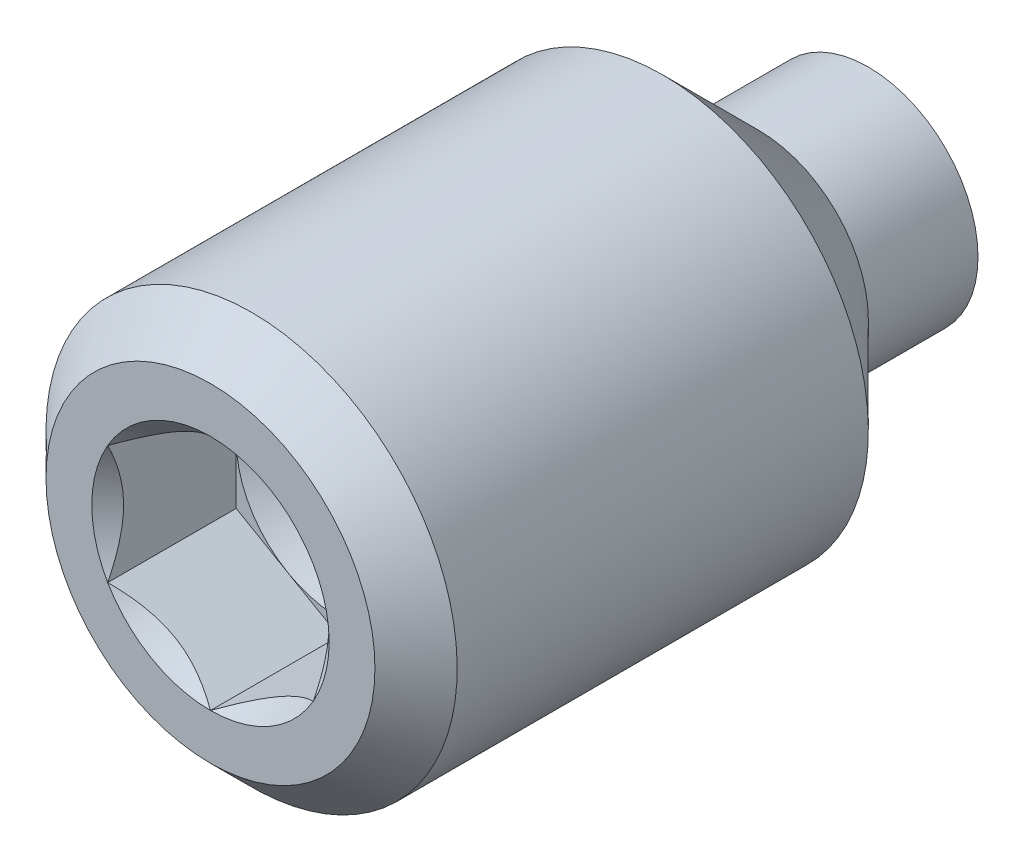
ISO-10303-21;
HEADER;
FILE_DESCRIPTION(('STEP AP214'),'2;1');
FILE_NAME('part.step','',(''),(''),'','','');
FILE_SCHEMA(('AUTOMOTIVE_DESIGN { 1 0 10303 214 1 1 1 1 }'));
ENDSEC;
DATA;
#1=APPLICATION_CONTEXT('core data for automotive mechanical design processes');
#2=APPLICATION_PROTOCOL_DEFINITION('international standard','automotive_design',2000,#1);
#3=PRODUCT_CONTEXT('',#1,'mechanical');
#4=PRODUCT('Part','Part','',(#3));
#5=PRODUCT_RELATED_PRODUCT_CATEGORY('part','',(#4));
#6=PRODUCT_DEFINITION_FORMATION('','',#4);
#7=PRODUCT_DEFINITION_CONTEXT('part definition',#1,'design');
#8=PRODUCT_DEFINITION('design','',#6,#7);
#9=PRODUCT_DEFINITION_SHAPE('','',#8);
#10=(LENGTH_UNIT() NAMED_UNIT(*) SI_UNIT(.MILLI.,.METRE.));
#11=(NAMED_UNIT(*) PLANE_ANGLE_UNIT() SI_UNIT($,.RADIAN.));
#12=(NAMED_UNIT(*) SI_UNIT($,.STERADIAN.) SOLID_ANGLE_UNIT());
#13=UNCERTAINTY_MEASURE_WITH_UNIT(LENGTH_MEASURE(1.E-05),#10,'distance_accuracy_value','');
#14=(GEOMETRIC_REPRESENTATION_CONTEXT(3) GLOBAL_UNCERTAINTY_ASSIGNED_CONTEXT((#13)) GLOBAL_UNIT_ASSIGNED_CONTEXT((#10,
#11,#12)) REPRESENTATION_CONTEXT('',''));
#15=CARTESIAN_POINT('',(0.,0.,0.));
#16=DIRECTION('',(0.,0.,1.));
#17=DIRECTION('',(1.,0.,0.));
#18=AXIS2_PLACEMENT_3D('',#15,#16,#17);
#19=CARTESIAN_POINT('',(0.75,-0.433012701892215,1.4625));
#20=DIRECTION('',(0.,0.,1.));
#21=DIRECTION('',(1.,0.,0.));
#22=AXIS2_PLACEMENT_3D('',#19,#20,#21);
#23=PLANE('',#22);
#24=CARTESIAN_POINT('',(0.,0.,1.4625));
#25=DIRECTION('',(0.,0.,1.));
#26=DIRECTION('',(1.,0.,0.));
#27=AXIS2_PLACEMENT_3D('',#24,#25,#26);
#28=CIRCLE('',#27,0.749999999999999);
#29=CARTESIAN_POINT('',(0.75,0.,1.4625));
#30=VERTEX_POINT('',#29);
#31=CARTESIAN_POINT('',(0.375,0.649519052838333,1.4625));
#32=VERTEX_POINT('',#31);
#33=EDGE_CURVE('E119',#30,#32,#28,.T.);
#34=ORIENTED_EDGE('',*,*,#33,.F.);
#35=DIRECTION('',(0.,1.,0.));
#36=VECTOR('',#35,1.);
#37=CARTESIAN_POINT('',(0.75,-0.433012701892215,1.4625));
#38=LINE('',#37,#36);
#39=CARTESIAN_POINT('',(0.75,0.433012701892224,1.4625));
#40=VERTEX_POINT('',#39);
#41=EDGE_CURVE('E148',#30,#40,#38,.T.);
#42=ORIENTED_EDGE('',*,*,#41,.T.);
#43=DIRECTION('',(-0.866025403784439,0.5,0.));
#44=VECTOR('',#43,1.);
#45=CARTESIAN_POINT('',(0.75,0.433012701892224,1.4625));
#46=LINE('',#45,#44);
#47=EDGE_CURVE('E142',#40,#32,#46,.T.);
#48=ORIENTED_EDGE('',*,*,#47,.T.);
#49=EDGE_LOOP('',(#34,#42,#48));
#50=FACE_BOUND('',#49,.T.);
#51=ADVANCED_FACE('F35',(#50),#23,.T.);
#52=CARTESIAN_POINT('',(-0.375,0.649519052838333,1.4625));
#53=VERTEX_POINT('',#52);
#54=EDGE_CURVE('E121',#32,#53,#28,.T.);
#55=ORIENTED_EDGE('',*,*,#54,.F.);
#56=CARTESIAN_POINT('',(0.,0.866025403784443,1.4625));
#57=VERTEX_POINT('',#56);
#58=EDGE_CURVE('E133',#32,#57,#46,.T.);
#59=ORIENTED_EDGE('',*,*,#58,.T.);
#60=DIRECTION('',(-0.866025403784439,-0.5,0.));
#61=VECTOR('',#60,1.);
#62=CARTESIAN_POINT('',(0.,0.866025403784443,1.4625));
#63=LINE('',#62,#61);
#64=EDGE_CURVE('E136',#57,#53,#63,.T.);
#65=ORIENTED_EDGE('',*,*,#64,.T.);
#66=EDGE_LOOP('',(#55,#59,#65));
#67=FACE_BOUND('',#66,.T.);
#68=ADVANCED_FACE('F132',(#67),#23,.T.);
#69=CARTESIAN_POINT('',(-0.75,0.,1.4625));
#70=VERTEX_POINT('',#69);
#71=EDGE_CURVE('E137',#53,#70,#28,.T.);
#72=ORIENTED_EDGE('',*,*,#71,.F.);
#73=CARTESIAN_POINT('',(-0.75,0.433012701892224,1.4625));
#74=VERTEX_POINT('',#73);
#75=EDGE_CURVE('E150',#53,#74,#63,.T.);
#76=ORIENTED_EDGE('',*,*,#75,.T.);
#77=DIRECTION('',(0.,-1.,0.));
#78=VECTOR('',#77,1.);
#79=CARTESIAN_POINT('',(-0.75,0.433012701892224,1.4625));
#80=LINE('',#79,#78);
#81=EDGE_CURVE('E156',#74,#70,#80,.T.);
#82=ORIENTED_EDGE('',*,*,#81,.T.);
#83=EDGE_LOOP('',(#72,#76,#82));
#84=FACE_BOUND('',#83,.T.);
#85=ADVANCED_FACE('F211',(#84),#23,.T.);
#86=CARTESIAN_POINT('',(-0.375,-0.649519052838325,1.4625));
#87=VERTEX_POINT('',#86);
#88=EDGE_CURVE('E496',#70,#87,#28,.T.);
#89=ORIENTED_EDGE('',*,*,#88,.F.);
#90=CARTESIAN_POINT('',(-0.75,-0.433012701892215,1.4625));
#91=VERTEX_POINT('',#90);
#92=EDGE_CURVE('E155',#70,#91,#80,.T.);
#93=ORIENTED_EDGE('',*,*,#92,.T.);
#94=DIRECTION('',(0.866025403784438,-0.5,0.));
#95=VECTOR('',#94,1.);
#96=CARTESIAN_POINT('',(-0.75,-0.433012701892215,1.4625));
#97=LINE('',#96,#95);
#98=EDGE_CURVE('E160',#91,#87,#97,.T.);
#99=ORIENTED_EDGE('',*,*,#98,.T.);
#100=EDGE_LOOP('',(#89,#93,#99));
#101=FACE_BOUND('',#100,.T.);
#102=ADVANCED_FACE('F202',(#101),#23,.T.);
#103=CARTESIAN_POINT('',(0.375,-0.649519052838325,1.4625));
#104=VERTEX_POINT('',#103);
#105=EDGE_CURVE('E56',#87,#104,#28,.T.);
#106=ORIENTED_EDGE('',*,*,#105,.F.);
#107=CARTESIAN_POINT('',(0.,-0.866025403784435,1.4625));
#108=VERTEX_POINT('',#107);
#109=EDGE_CURVE('E159',#87,#108,#97,.T.);
#110=ORIENTED_EDGE('',*,*,#109,.T.);
#111=DIRECTION('',(0.866025403784439,0.5,0.));
#112=VECTOR('',#111,1.);
#113=CARTESIAN_POINT('',(0.,-0.866025403784435,1.4625));
#114=LINE('',#113,#112);
#115=EDGE_CURVE('E233',#108,#104,#114,.T.);
#116=ORIENTED_EDGE('',*,*,#115,.T.);
#117=EDGE_LOOP('',(#106,#110,#116));
#118=FACE_BOUND('',#117,.T.);
#119=ADVANCED_FACE('F195',(#118),#23,.T.);
#120=CARTESIAN_POINT('',(0.,0.,2.4));
#121=DIRECTION('',(0.,0.,1.));
#122=DIRECTION('',(0.,-1.,0.));
#123=AXIS2_PLACEMENT_3D('',#120,#121,#122);
#124=PLANE('',#123);
#125=CARTESIAN_POINT('',(0.,0.,2.4));
#126=DIRECTION('',(0.,0.,1.));
#127=DIRECTION('',(1.,0.,0.));
#128=AXIS2_PLACEMENT_3D('',#125,#126,#127);
#129=CIRCLE('',#128,0.866025403784439);
#130=CARTESIAN_POINT('',(0.,-0.866025403784435,2.4));
#131=VERTEX_POINT('',#130);
#132=CARTESIAN_POINT('',(0.75,-0.433012701892215,2.4));
#133=VERTEX_POINT('',#132);
#134=EDGE_CURVE('E478',#131,#133,#129,.T.);
#135=ORIENTED_EDGE('',*,*,#134,.F.);
#136=CARTESIAN_POINT('',(-0.75,-0.433012701892215,2.4));
#137=VERTEX_POINT('',#136);
#138=EDGE_CURVE('E63',#137,#131,#129,.T.);
#139=ORIENTED_EDGE('',*,*,#138,.F.);
#140=CARTESIAN_POINT('',(-0.75,0.433012701892224,2.4));
#141=VERTEX_POINT('',#140);
#142=EDGE_CURVE('E484',#141,#137,#129,.T.);
#143=ORIENTED_EDGE('',*,*,#142,.F.);
#144=CARTESIAN_POINT('',(0.,0.866025403784443,2.4));
#145=VERTEX_POINT('',#144);
#146=EDGE_CURVE('E482',#145,#141,#129,.T.);
#147=ORIENTED_EDGE('',*,*,#146,.F.);
#148=CARTESIAN_POINT('',(0.75,0.433012701892224,2.4));
#149=VERTEX_POINT('',#148);
#150=EDGE_CURVE('E479',#149,#145,#129,.T.);
#151=ORIENTED_EDGE('',*,*,#150,.F.);
#152=EDGE_CURVE('E127',#133,#149,#129,.T.);
#153=ORIENTED_EDGE('',*,*,#152,.F.);
#154=EDGE_LOOP('',(#135,#139,#143,#147,#151,#153));
#155=FACE_BOUND('',#154,.T.);
#156=CARTESIAN_POINT('',(0.,0.,2.4));
#157=DIRECTION('',(0.,0.,-1.));
#158=DIRECTION('',(0.,1.,0.));
#159=AXIS2_PLACEMENT_3D('',#156,#157,#158);
#160=CIRCLE('',#159,1.2);
#161=CARTESIAN_POINT('',(0.,1.2,2.4));
#162=VERTEX_POINT('',#161);
#163=EDGE_CURVE('E49',#162,#162,#160,.T.);
#164=ORIENTED_EDGE('',*,*,#163,.F.);
#165=EDGE_LOOP('',(#164));
#166=FACE_BOUND('',#165,.T.);
#167=ADVANCED_FACE('F37',(#155,#166),#124,.T.);
#168=CARTESIAN_POINT('',(0.,0.,2.1));
#169=DIRECTION('',(0.,0.,-1.));
#170=DIRECTION('',(0.,1.,0.));
#171=AXIS2_PLACEMENT_3D('',#168,#169,#170);
#172=CONICAL_SURFACE('',#171,1.5,0.785398163397448);
#173=ORIENTED_EDGE('',*,*,#163,.T.);
#174=EDGE_LOOP('',(#173));
#175=FACE_BOUND('',#174,.T.);
#176=CARTESIAN_POINT('',(0.,0.,2.1));
#177=DIRECTION('',(0.,0.,-1.));
#178=DIRECTION('',(0.,1.,0.));
#179=AXIS2_PLACEMENT_3D('',#176,#177,#178);
#180=CIRCLE('',#179,1.5);
#181=CARTESIAN_POINT('',(0.,1.5,2.1));
#182=VERTEX_POINT('',#181);
#183=EDGE_CURVE('E186',#182,#182,#180,.T.);
#184=ORIENTED_EDGE('',*,*,#183,.F.);
#185=EDGE_LOOP('',(#184));
#186=FACE_BOUND('',#185,.T.);
#187=ADVANCED_FACE('F191',(#175,#186),#172,.T.);
#188=CARTESIAN_POINT('',(0.,0.,-2.4));
#189=DIRECTION('',(0.,0.,-1.));
#190=DIRECTION('',(0.,1.,0.));
#191=AXIS2_PLACEMENT_3D('',#188,#189,#190);
#192=CYLINDRICAL_SURFACE('',#191,1.5);
#193=ORIENTED_EDGE('',*,*,#183,.T.);
#194=EDGE_LOOP('',(#193));
#195=FACE_BOUND('',#194,.T.);
#196=CARTESIAN_POINT('',(0.,0.,-0.900000000000009));
#197=DIRECTION('',(0.,0.,-1.));
#198=DIRECTION('',(0.,1.,0.));
#199=AXIS2_PLACEMENT_3D('',#196,#197,#198);
#200=CIRCLE('',#199,1.5);
#201=CARTESIAN_POINT('',(0.,1.5,-0.900000000000008));
#202=VERTEX_POINT('',#201);
#203=EDGE_CURVE('E183',#202,#202,#200,.T.);
#204=ORIENTED_EDGE('',*,*,#203,.F.);
#205=EDGE_LOOP('',(#204));
#206=FACE_BOUND('',#205,.T.);
#207=ADVANCED_FACE('F201',(#195,#206),#192,.T.);
#208=CARTESIAN_POINT('',(0.,0.,-1.6));
#209=DIRECTION('',(0.,0.,1.));
#210=DIRECTION('',(0.,-1.,0.));
#211=AXIS2_PLACEMENT_3D('',#208,#209,#210);
#212=CONICAL_SURFACE('',#211,0.800000000000001,0.785398163397454);
#213=ORIENTED_EDGE('',*,*,#203,.T.);
#214=EDGE_LOOP('',(#213));
#215=FACE_BOUND('',#214,.T.);
#216=CARTESIAN_POINT('',(0.,0.,-1.6));
#217=DIRECTION('',(0.,0.,-1.));
#218=DIRECTION('',(0.,1.,0.));
#219=AXIS2_PLACEMENT_3D('',#216,#217,#218);
#220=CIRCLE('',#219,0.800000000000001);
#221=CARTESIAN_POINT('',(0.,0.8,-1.6));
#222=VERTEX_POINT('',#221);
#223=EDGE_CURVE('E180',#222,#222,#220,.T.);
#224=ORIENTED_EDGE('',*,*,#223,.F.);
#225=EDGE_LOOP('',(#224));
#226=FACE_BOUND('',#225,.T.);
#227=ADVANCED_FACE('F428',(#215,#226),#212,.T.);
#228=CARTESIAN_POINT('',(0.,0.,-2.4));
#229=DIRECTION('',(0.,0.,-1.));
#230=DIRECTION('',(0.,1.,0.));
#231=AXIS2_PLACEMENT_3D('',#228,#229,#230);
#232=CYLINDRICAL_SURFACE('',#231,0.800000000000001);
#233=ORIENTED_EDGE('',*,*,#223,.T.);
#234=EDGE_LOOP('',(#233));
#235=FACE_BOUND('',#234,.T.);
#236=CARTESIAN_POINT('',(0.,0.,-2.4));
#237=DIRECTION('',(0.,0.,-1.));
#238=DIRECTION('',(0.,1.,0.));
#239=AXIS2_PLACEMENT_3D('',#236,#237,#238);
#240=CIRCLE('',#239,0.800000000000001);
#241=CARTESIAN_POINT('',(0.,0.8,-2.4));
#242=VERTEX_POINT('',#241);
#243=EDGE_CURVE('E167',#242,#242,#240,.T.);
#244=ORIENTED_EDGE('',*,*,#243,.F.);
#245=EDGE_LOOP('',(#244));
#246=FACE_BOUND('',#245,.T.);
#247=ADVANCED_FACE('F420',(#235,#246),#232,.T.);
#248=CARTESIAN_POINT('',(0.,0.8,-2.4));
#249=DIRECTION('',(0.,0.,-1.));
#250=DIRECTION('',(0.,1.,0.));
#251=AXIS2_PLACEMENT_3D('',#248,#249,#250);
#252=PLANE('',#251);
#253=ORIENTED_EDGE('',*,*,#243,.T.);
#254=EDGE_LOOP('',(#253));
#255=FACE_BOUND('',#254,.T.);
#256=ADVANCED_FACE('F394',(#255),#252,.T.);
#257=CARTESIAN_POINT('',(0.,0.,2.4));
#258=DIRECTION('',(0.,0.,1.));
#259=DIRECTION('',(1.,0.,0.));
#260=AXIS2_PLACEMENT_3D('',#257,#258,#259);
#261=CONICAL_SURFACE('',#260,0.866025403784439,0.78539816339745);
#262=ORIENTED_EDGE('',*,*,#152,.T.);
#263=CARTESIAN_POINT('',(0.75,-0.863604064848459,2.6777892581354));
#264=CARTESIAN_POINT('',(0.75,-0.842575879734329,2.66191493200841));
#265=CARTESIAN_POINT('',(0.75,-0.821430496291557,2.646196265183));
#266=CARTESIAN_POINT('',(0.75,-0.778857857419016,2.61513452062663));
#267=CARTESIAN_POINT('',(0.75,-0.757430533042233,2.59979153749355));
#268=CARTESIAN_POINT('',(0.75,-0.692340710712932,2.55420358029367));
#269=CARTESIAN_POINT('',(0.75,-0.648190081053409,2.52464409174343));
#270=CARTESIAN_POINT('',(0.75,-0.555607181501746,2.4666155826928));
#271=CARTESIAN_POINT('',(0.75,-0.507074363017992,2.43830510936579));
#272=CARTESIAN_POINT('',(0.75,-0.407587529772333,2.38651811176889));
#273=CARTESIAN_POINT('',(0.75,-0.356642419548466,2.36302529153185));
#274=CARTESIAN_POINT('',(0.75,-0.280165468820766,2.33428689950068));
#275=CARTESIAN_POINT('',(0.75,-0.255770023930567,2.32603927481305));
#276=CARTESIAN_POINT('',(0.75,-0.206403277885127,2.31149717542019));
#277=CARTESIAN_POINT('',(0.75,-0.181431937185902,2.30520283526912));
#278=CARTESIAN_POINT('',(0.75,-0.10669987940492,2.2899931738806));
#279=CARTESIAN_POINT('',(0.75,-0.0561907171762129,2.28437718471289));
#280=CARTESIAN_POINT('',(0.75,0.0430767231749106,2.28362825645435));
#281=CARTESIAN_POINT('',(0.75,0.0918322434166328,2.28812345140561));
#282=CARTESIAN_POINT('',(0.75,0.164112195698299,2.30133730744598));
#283=CARTESIAN_POINT('',(0.75,0.188278676879441,2.30690144638208));
#284=CARTESIAN_POINT('',(0.75,0.236094480120335,2.31992316614873));
#285=CARTESIAN_POINT('',(0.75,0.259743845273046,2.32738058854766));
#286=CARTESIAN_POINT('',(0.75,0.334198278463824,2.35366646946609));
#287=CARTESIAN_POINT('',(0.75,0.383940060445499,2.37549033804844));
#288=CARTESIAN_POINT('',(0.75,0.481089225076671,2.42401180410059));
#289=CARTESIAN_POINT('',(0.75,0.528487417973021,2.45072691131035));
#290=CARTESIAN_POINT('',(0.75,0.619071540465256,2.50584285115078));
#291=CARTESIAN_POINT('',(0.75,0.662349745300244,2.53409394545219));
#292=CARTESIAN_POINT('',(0.75,0.726111623216229,2.5777671470975));
#293=CARTESIAN_POINT('',(0.75,0.747090419255285,2.5924788605167));
#294=CARTESIAN_POINT('',(0.75,0.788761341501864,2.6222913841024));
#295=CARTESIAN_POINT('',(0.75,0.809453544535624,2.63739208676303));
#296=CARTESIAN_POINT('',(0.75,0.830026390097473,2.65265408930473));
#297=B_SPLINE_CURVE_WITH_KNOTS('',3,(#263,#264,#265,#266,#267,#268,#269,#270,#271,#272,#273,
#274,#275,#276,#277,#278,#279,#280,#281,#282,#283,#284,#285,#286,#287,#288,#289,#290,#291,#292,
#293,#294,#295,#296),.UNSPECIFIED.,.F.,.F.,(4,2,2,2,2,2,2,2,2,2,2,2,2,2,2,2,4),(0.,
0.0790398443124681,0.158099390497594,0.317425208674102,0.485845155681378,0.653685658303958,
0.730869805636066,0.80805926870401,0.959469653380781,1.10540290447489,1.17973203111653,
1.25405493988072,1.41653726506054,1.57961304287543,1.73458511695816,1.81145152932467,
1.88829692115811),.UNSPECIFIED.);
#298=EDGE_CURVE('E11',#133,#149,#297,.T.);
#299=ORIENTED_EDGE('',*,*,#298,.F.);
#300=EDGE_LOOP('',(#262,#299));
#301=FACE_BOUND('',#300,.T.);
#302=ADVANCED_FACE('F224',(#301),#261,.F.);
#303=ORIENTED_EDGE('',*,*,#150,.T.);
#304=CARTESIAN_POINT('',(0.7502,0.432897231838386,2.40011549314477));
#305=CARTESIAN_POINT('',(0.724410037442319,0.447787073663453,2.38523411046392));
#306=CARTESIAN_POINT('',(0.698188797871341,0.462925913388243,2.37122626560696));
#307=CARTESIAN_POINT('',(0.644720291764294,0.493795969782314,2.34557752468226));
#308=CARTESIAN_POINT('',(0.617467932539427,0.509530126716843,2.33395091170567));
#309=CARTESIAN_POINT('',(0.562514649618647,0.541257419404009,2.31403404577224));
#310=CARTESIAN_POINT('',(0.53482774330449,0.557242462217515,2.30569369408137));
#311=CARTESIAN_POINT('',(0.478844404869146,0.589564457733295,2.29284274196143));
#312=CARTESIAN_POINT('',(0.450549685156354,0.605900421776121,2.28832254058884));
#313=CARTESIAN_POINT('',(0.401789710731156,0.634052006136188,2.28424583309744));
#314=CARTESIAN_POINT('',(0.381387934344427,0.645830977225013,2.28364279661408));
#315=CARTESIAN_POINT('',(0.340623865303639,0.669366123458976,2.28465450601553));
#316=CARTESIAN_POINT('',(0.320261582348544,0.681122293004416,2.28626974099003));
#317=CARTESIAN_POINT('',(0.259465456913175,0.716222952390212,2.29433614697304));
#318=CARTESIAN_POINT('',(0.2193341450039,0.739392776123965,2.30400893582772));
#319=CARTESIAN_POINT('',(0.148889599645974,0.780063953349304,2.32735631797232));
#320=CARTESIAN_POINT('',(0.118246427990913,0.797755796753177,2.33980855807225));
#321=CARTESIAN_POINT('',(0.0581606541952101,0.832446334428594,2.36785961023086));
#322=CARTESIAN_POINT('',(0.0287145116184092,0.849447072771906,2.38344818590375));
#323=CARTESIAN_POINT('',(-0.000199999999999927,0.866140873838281,2.40011549314477));
#324=B_SPLINE_CURVE_WITH_KNOTS('',3,(#304,#305,#306,#307,#308,#309,#310,#311,#312,#313,#314,
#315,#316,#317,#318,#319,#320,#321,#322,#323),.UNSPECIFIED.,.F.,.F.,(4,2,2,2,2,2,2,2,2,4),(0.,
0.0999419466095599,0.200466857654446,0.299393763705718,0.398071297300231,0.468665775681749,
0.53927582139884,0.680536257244567,0.792918418368074,0.904939568716032),.UNSPECIFIED.);
#325=EDGE_CURVE('E259',#149,#145,#324,.T.);
#326=ORIENTED_EDGE('',*,*,#325,.F.);
#327=EDGE_LOOP('',(#303,#326));
#328=FACE_BOUND('',#327,.T.);
#329=ADVANCED_FACE('F379',(#328),#261,.F.);
#330=ORIENTED_EDGE('',*,*,#146,.T.);
#331=CARTESIAN_POINT('',(0.000200000000000008,0.866140873838281,2.40011549314477));
#332=CARTESIAN_POINT('',(-0.0255899625576815,0.851251032013213,2.38523411046392));
#333=CARTESIAN_POINT('',(-0.0518112021286593,0.836112192288423,2.37122626560696));
#334=CARTESIAN_POINT('',(-0.105279708235706,0.805242135894353,2.34557752468226));
#335=CARTESIAN_POINT('',(-0.132532067460573,0.789507978959824,2.33395091170567));
#336=CARTESIAN_POINT('',(-0.187485350381353,0.757780686272657,2.31403404577224));
#337=CARTESIAN_POINT('',(-0.21517225669551,0.741795643459151,2.30569369408137));
#338=CARTESIAN_POINT('',(-0.271155595130853,0.709473647943372,2.29284274196143));
#339=CARTESIAN_POINT('',(-0.299450314843645,0.693137683900546,2.28832254058884));
#340=CARTESIAN_POINT('',(-0.348210289268844,0.664986099540479,2.28424583309744));
#341=CARTESIAN_POINT('',(-0.368612065655573,0.653207128451654,2.28364279661408));
#342=CARTESIAN_POINT('',(-0.409376134696361,0.629671982217691,2.28465450601553));
#343=CARTESIAN_POINT('',(-0.429738417651456,0.617915812672251,2.28626974099003));
#344=CARTESIAN_POINT('',(-0.490534543086824,0.582815153286455,2.29433614697304));
#345=CARTESIAN_POINT('',(-0.5306658549961,0.559645329552702,2.30400893582772));
#346=CARTESIAN_POINT('',(-0.601110400354026,0.518974152327362,2.32735631797232));
#347=CARTESIAN_POINT('',(-0.631753572009087,0.501282308923489,2.33980855807225));
#348=CARTESIAN_POINT('',(-0.69183934580479,0.466591771248073,2.36785961023086));
#349=CARTESIAN_POINT('',(-0.721285488381591,0.449591032904761,2.38344818590375));
#350=CARTESIAN_POINT('',(-0.7502,0.432897231838386,2.40011549314477));
#351=B_SPLINE_CURVE_WITH_KNOTS('',3,(#331,#332,#333,#334,#335,#336,#337,#338,#339,#340,#341,
#342,#343,#344,#345,#346,#347,#348,#349,#350),.UNSPECIFIED.,.F.,.F.,(4,2,2,2,2,2,2,2,2,4),(0.,
0.0999419466095597,0.200466857654446,0.299393763705718,0.398071297300231,0.468665775681748,
0.53927582139884,0.680536257244567,0.792918418368074,0.904939568716032),.UNSPECIFIED.);
#352=EDGE_CURVE('E268',#145,#141,#351,.T.);
#353=ORIENTED_EDGE('',*,*,#352,.F.);
#354=EDGE_LOOP('',(#330,#353));
#355=FACE_BOUND('',#354,.T.);
#356=ADVANCED_FACE('F371',(#355),#261,.F.);
#357=ORIENTED_EDGE('',*,*,#142,.T.);
#358=CARTESIAN_POINT('',(-0.75,-0.863604064848458,2.6777892581354));
#359=CARTESIAN_POINT('',(-0.75,-0.842575879734328,2.66191493200841));
#360=CARTESIAN_POINT('',(-0.75,-0.821430496291556,2.646196265183));
#361=CARTESIAN_POINT('',(-0.75,-0.778857857419015,2.61513452062663));
#362=CARTESIAN_POINT('',(-0.75,-0.757430533042232,2.59979153749355));
#363=CARTESIAN_POINT('',(-0.75,-0.692340710712931,2.55420358029367));
#364=CARTESIAN_POINT('',(-0.75,-0.648190081053409,2.52464409174343));
#365=CARTESIAN_POINT('',(-0.75,-0.555607181501746,2.4666155826928));
#366=CARTESIAN_POINT('',(-0.75,-0.507074363017992,2.43830510936579));
#367=CARTESIAN_POINT('',(-0.75,-0.407587529772332,2.38651811176889));
#368=CARTESIAN_POINT('',(-0.75,-0.356642419548466,2.36302529153185));
#369=CARTESIAN_POINT('',(-0.75,-0.280165468820766,2.33428689950068));
#370=CARTESIAN_POINT('',(-0.75,-0.255770023930567,2.32603927481305));
#371=CARTESIAN_POINT('',(-0.75,-0.206403277885127,2.31149717542019));
#372=CARTESIAN_POINT('',(-0.75,-0.181431937185902,2.30520283526912));
#373=CARTESIAN_POINT('',(-0.75,-0.10669987940492,2.2899931738806));
#374=CARTESIAN_POINT('',(-0.75,-0.0561907171762126,2.28437718471289));
#375=CARTESIAN_POINT('',(-0.75,0.0430767231749111,2.28362825645435));
#376=CARTESIAN_POINT('',(-0.75,0.0918322434166333,2.28812345140561));
#377=CARTESIAN_POINT('',(-0.75,0.164112195698299,2.30133730744598));
#378=CARTESIAN_POINT('',(-0.75,0.188278676879441,2.30690144638208));
#379=CARTESIAN_POINT('',(-0.75,0.236094480120336,2.31992316614873));
#380=CARTESIAN_POINT('',(-0.75,0.259743845273046,2.32738058854766));
#381=CARTESIAN_POINT('',(-0.75,0.334198278463824,2.35366646946609));
#382=CARTESIAN_POINT('',(-0.75,0.3839400604455,2.37549033804845));
#383=CARTESIAN_POINT('',(-0.75,0.481089225076672,2.42401180410059));
#384=CARTESIAN_POINT('',(-0.75,0.528487417973022,2.45072691131035));
#385=CARTESIAN_POINT('',(-0.75,0.619071540465256,2.50584285115078));
#386=CARTESIAN_POINT('',(-0.75,0.662349745300244,2.53409394545219));
#387=CARTESIAN_POINT('',(-0.75,0.72611162321623,2.5777671470975));
#388=CARTESIAN_POINT('',(-0.75,0.747090419255286,2.5924788605167));
#389=CARTESIAN_POINT('',(-0.75,0.788761341501865,2.6222913841024));
#390=CARTESIAN_POINT('',(-0.75,0.809453544535625,2.63739208676303));
#391=CARTESIAN_POINT('',(-0.75,0.830026390097474,2.65265408930473));
#392=B_SPLINE_CURVE_WITH_KNOTS('',3,(#358,#359,#360,#361,#362,#363,#364,#365,#366,#367,#368,
#369,#370,#371,#372,#373,#374,#375,#376,#377,#378,#379,#380,#381,#382,#383,#384,#385,#386,#387,
#388,#389,#390,#391),.UNSPECIFIED.,.F.,.F.,(4,2,2,2,2,2,2,2,2,2,2,2,2,2,2,2,4),(0.,
0.079039844312468,0.158099390497593,0.317425208674101,0.485845155681377,0.653685658303957,
0.730869805636065,0.808059268704009,0.95946965338078,1.10540290447489,1.17973203111653,
1.25405493988072,1.41653726506054,1.57961304287543,1.73458511695816,1.81145152932467,
1.88829692115811),.UNSPECIFIED.);
#393=EDGE_CURVE('E274',#141,#137,#392,.F.);
#394=ORIENTED_EDGE('',*,*,#393,.F.);
#395=EDGE_LOOP('',(#357,#394));
#396=FACE_BOUND('',#395,.T.);
#397=ADVANCED_FACE('F364',(#396),#261,.F.);
#398=ORIENTED_EDGE('',*,*,#138,.T.);
#399=CARTESIAN_POINT('',(-0.7502,-0.432897231838377,2.40011549314477));
#400=CARTESIAN_POINT('',(-0.724410037442319,-0.447787073663445,2.38523411046392));
#401=CARTESIAN_POINT('',(-0.698188797871341,-0.462925913388235,2.37122626560696));
#402=CARTESIAN_POINT('',(-0.644720291764294,-0.493795969782305,2.34557752468226));
#403=CARTESIAN_POINT('',(-0.617467932539427,-0.509530126716834,2.33395091170567));
#404=CARTESIAN_POINT('',(-0.562514649618647,-0.541257419404001,2.31403404577224));
#405=CARTESIAN_POINT('',(-0.534827743304491,-0.557242462217507,2.30569369408137));
#406=CARTESIAN_POINT('',(-0.478844404869147,-0.589564457733286,2.29284274196143));
#407=CARTESIAN_POINT('',(-0.450549685156355,-0.605900421776112,2.28832254058884));
#408=CARTESIAN_POINT('',(-0.401789710731157,-0.634052006136179,2.28424583309744));
#409=CARTESIAN_POINT('',(-0.381387934344428,-0.645830977225004,2.28364279661408));
#410=CARTESIAN_POINT('',(-0.34062386530364,-0.669366123458967,2.28465450601553));
#411=CARTESIAN_POINT('',(-0.320261582348545,-0.681122293004407,2.28626974099003));
#412=CARTESIAN_POINT('',(-0.259465456913176,-0.716222952390203,2.29433614697304));
#413=CARTESIAN_POINT('',(-0.219334145003901,-0.739392776123956,2.30400893582772));
#414=CARTESIAN_POINT('',(-0.148889599645975,-0.780063953349296,2.32735631797231));
#415=CARTESIAN_POINT('',(-0.118246427990914,-0.797755796753169,2.33980855807225));
#416=CARTESIAN_POINT('',(-0.0581606541952106,-0.832446334428585,2.36785961023086));
#417=CARTESIAN_POINT('',(-0.0287145116184095,-0.849447072771897,2.38344818590375));
#418=CARTESIAN_POINT('',(0.000199999999999884,-0.866140873838273,2.40011549314477));
#419=B_SPLINE_CURVE_WITH_KNOTS('',3,(#399,#400,#401,#402,#403,#404,#405,#406,#407,#408,#409,
#410,#411,#412,#413,#414,#415,#416,#417,#418),.UNSPECIFIED.,.F.,.F.,(4,2,2,2,2,2,2,2,2,4),(0.,
0.0999419466095595,0.200466857654446,0.299393763705717,0.39807129730023,0.468665775681748,
0.539275821398839,0.680536257244566,0.792918418368073,0.904939568716032),.UNSPECIFIED.);
#420=EDGE_CURVE('E245',#137,#131,#419,.T.);
#421=ORIENTED_EDGE('',*,*,#420,.F.);
#422=EDGE_LOOP('',(#398,#421));
#423=FACE_BOUND('',#422,.T.);
#424=ADVANCED_FACE('F222',(#423),#261,.F.);
#425=ORIENTED_EDGE('',*,*,#134,.T.);
#426=CARTESIAN_POINT('',(-0.000200000000000207,-0.866140873838273,2.40011549314477));
#427=CARTESIAN_POINT('',(0.0255899625576814,-0.851251032013205,2.38523411046392));
#428=CARTESIAN_POINT('',(0.0518112021286591,-0.836112192288415,2.37122626560696));
#429=CARTESIAN_POINT('',(0.105279708235706,-0.805242135894344,2.34557752468226));
#430=CARTESIAN_POINT('',(0.132532067460573,-0.789507978959815,2.33395091170567));
#431=CARTESIAN_POINT('',(0.187485350381353,-0.757780686272649,2.31403404577224));
#432=CARTESIAN_POINT('',(0.215172256695509,-0.741795643459143,2.30569369408137));
#433=CARTESIAN_POINT('',(0.271155595130853,-0.709473647943363,2.29284274196143));
#434=CARTESIAN_POINT('',(0.299450314843645,-0.693137683900538,2.28832254058884));
#435=CARTESIAN_POINT('',(0.348210289268843,-0.66498609954047,2.28424583309744));
#436=CARTESIAN_POINT('',(0.368612065655572,-0.653207128451646,2.28364279661408));
#437=CARTESIAN_POINT('',(0.40937613469636,-0.629671982217683,2.28465450601553));
#438=CARTESIAN_POINT('',(0.429738417651455,-0.617915812672243,2.28626974099003));
#439=CARTESIAN_POINT('',(0.490534543086824,-0.582815153286447,2.29433614697304));
#440=CARTESIAN_POINT('',(0.530665854996099,-0.559645329552694,2.30400893582772));
#441=CARTESIAN_POINT('',(0.601110400354026,-0.518974152327354,2.32735631797232));
#442=CARTESIAN_POINT('',(0.631753572009086,-0.501282308923481,2.33980855807225));
#443=CARTESIAN_POINT('',(0.69183934580479,-0.466591771248065,2.36785961023086));
#444=CARTESIAN_POINT('',(0.721285488381591,-0.449591032904753,2.38344818590375));
#445=CARTESIAN_POINT('',(0.7502,-0.432897231838378,2.40011549314477));
#446=B_SPLINE_CURVE_WITH_KNOTS('',3,(#426,#427,#428,#429,#430,#431,#432,#433,#434,#435,#436,
#437,#438,#439,#440,#441,#442,#443,#444,#445),.UNSPECIFIED.,.F.,.F.,(4,2,2,2,2,2,2,2,2,4),(0.,
0.0999419466095597,0.200466857654446,0.299393763705717,0.39807129730023,0.468665775681748,
0.539275821398839,0.680536257244567,0.792918418368074,0.904939568716032),.UNSPECIFIED.);
#447=EDGE_CURVE('E235',#131,#133,#446,.T.);
#448=ORIENTED_EDGE('',*,*,#447,.F.);
#449=EDGE_LOOP('',(#425,#448));
#450=FACE_BOUND('',#449,.T.);
#451=ADVANCED_FACE('F215',(#450),#261,.F.);
#452=EDGE_CURVE('E123',#104,#30,#28,.T.);
#453=ORIENTED_EDGE('',*,*,#452,.F.);
#454=CARTESIAN_POINT('',(0.75,-0.433012701892215,1.4625));
#455=VERTEX_POINT('',#454);
#456=EDGE_CURVE('E227',#104,#455,#114,.T.);
#457=ORIENTED_EDGE('',*,*,#456,.T.);
#458=EDGE_CURVE('E146',#455,#30,#38,.T.);
#459=ORIENTED_EDGE('',*,*,#458,.T.);
#460=EDGE_LOOP('',(#453,#457,#459));
#461=FACE_BOUND('',#460,.T.);
#462=ADVANCED_FACE('F205',(#461),#23,.T.);
#463=CARTESIAN_POINT('',(0.75,-0.433012701892215,1.4625));
#464=DIRECTION('',(1.,0.,0.));
#465=DIRECTION('',(0.,0.,-1.));
#466=AXIS2_PLACEMENT_3D('',#463,#464,#465);
#467=PLANE('',#466);
#468=DIRECTION('',(0.,0.,1.));
#469=VECTOR('',#468,1.);
#470=CARTESIAN_POINT('',(0.75,-0.433012701892215,1.4625));
#471=LINE('',#470,#469);
#472=EDGE_CURVE('E163',#455,#133,#471,.T.);
#473=ORIENTED_EDGE('',*,*,#472,.T.);
#474=ORIENTED_EDGE('',*,*,#298,.T.);
#475=DIRECTION('',(0.,0.,1.));
#476=VECTOR('',#475,1.);
#477=CARTESIAN_POINT('',(0.75,0.433012701892224,1.4625));
#478=LINE('',#477,#476);
#479=EDGE_CURVE('E174',#40,#149,#478,.T.);
#480=ORIENTED_EDGE('',*,*,#479,.F.);
#481=ORIENTED_EDGE('',*,*,#41,.F.);
#482=ORIENTED_EDGE('',*,*,#458,.F.);
#483=EDGE_LOOP('',(#473,#474,#480,#481,#482));
#484=FACE_BOUND('',#483,.T.);
#485=ADVANCED_FACE('F214',(#484),#467,.F.);
#486=CARTESIAN_POINT('',(0.75,0.433012701892224,1.4625));
#487=DIRECTION('',(0.5,0.866025403784439,0.));
#488=DIRECTION('',(-0.866025403784439,0.5,0.));
#489=AXIS2_PLACEMENT_3D('',#486,#487,#488);
#490=PLANE('',#489);
#491=ORIENTED_EDGE('',*,*,#479,.T.);
#492=ORIENTED_EDGE('',*,*,#325,.T.);
#493=DIRECTION('',(0.,0.,1.));
#494=VECTOR('',#493,1.);
#495=CARTESIAN_POINT('',(0.,0.866025403784443,1.4625));
#496=LINE('',#495,#494);
#497=EDGE_CURVE('E145',#57,#145,#496,.T.);
#498=ORIENTED_EDGE('',*,*,#497,.F.);
#499=ORIENTED_EDGE('',*,*,#58,.F.);
#500=ORIENTED_EDGE('',*,*,#47,.F.);
#501=EDGE_LOOP('',(#491,#492,#498,#499,#500));
#502=FACE_BOUND('',#501,.T.);
#503=ADVANCED_FACE('F141',(#502),#490,.F.);
#504=CARTESIAN_POINT('',(0.,0.866025403784443,1.4625));
#505=DIRECTION('',(-0.5,0.866025403784439,0.));
#506=DIRECTION('',(-0.866025403784439,-0.5,0.));
#507=AXIS2_PLACEMENT_3D('',#504,#505,#506);
#508=PLANE('',#507);
#509=ORIENTED_EDGE('',*,*,#497,.T.);
#510=ORIENTED_EDGE('',*,*,#352,.T.);
#511=DIRECTION('',(0.,0.,1.));
#512=VECTOR('',#511,1.);
#513=CARTESIAN_POINT('',(-0.75,0.433012701892224,1.4625));
#514=LINE('',#513,#512);
#515=EDGE_CURVE('E170',#74,#141,#514,.T.);
#516=ORIENTED_EDGE('',*,*,#515,.F.);
#517=ORIENTED_EDGE('',*,*,#75,.F.);
#518=ORIENTED_EDGE('',*,*,#64,.F.);
#519=EDGE_LOOP('',(#509,#510,#516,#517,#518));
#520=FACE_BOUND('',#519,.T.);
#521=ADVANCED_FACE('F285',(#520),#508,.F.);
#522=CARTESIAN_POINT('',(-0.75,0.433012701892224,1.4625));
#523=DIRECTION('',(-1.,0.,0.));
#524=DIRECTION('',(0.,0.,1.));
#525=AXIS2_PLACEMENT_3D('',#522,#523,#524);
#526=PLANE('',#525);
#527=ORIENTED_EDGE('',*,*,#515,.T.);
#528=ORIENTED_EDGE('',*,*,#393,.T.);
#529=DIRECTION('',(0.,0.,1.));
#530=VECTOR('',#529,1.);
#531=CARTESIAN_POINT('',(-0.75,-0.433012701892215,1.4625));
#532=LINE('',#531,#530);
#533=EDGE_CURVE('E168',#91,#137,#532,.T.);
#534=ORIENTED_EDGE('',*,*,#533,.F.);
#535=ORIENTED_EDGE('',*,*,#92,.F.);
#536=ORIENTED_EDGE('',*,*,#81,.F.);
#537=EDGE_LOOP('',(#527,#528,#534,#535,#536));
#538=FACE_BOUND('',#537,.T.);
#539=ADVANCED_FACE('F281',(#538),#526,.F.);
#540=CARTESIAN_POINT('',(-0.75,-0.433012701892215,1.4625));
#541=DIRECTION('',(-0.5,-0.866025403784438,0.));
#542=DIRECTION('',(0.866025403784439,-0.5,0.));
#543=AXIS2_PLACEMENT_3D('',#540,#541,#542);
#544=PLANE('',#543);
#545=ORIENTED_EDGE('',*,*,#533,.T.);
#546=ORIENTED_EDGE('',*,*,#420,.T.);
#547=DIRECTION('',(0.,0.,1.));
#548=VECTOR('',#547,1.);
#549=CARTESIAN_POINT('',(0.,-0.866025403784435,1.4625));
#550=LINE('',#549,#548);
#551=EDGE_CURVE('E164',#108,#131,#550,.T.);
#552=ORIENTED_EDGE('',*,*,#551,.F.);
#553=ORIENTED_EDGE('',*,*,#109,.F.);
#554=ORIENTED_EDGE('',*,*,#98,.F.);
#555=EDGE_LOOP('',(#545,#546,#552,#553,#554));
#556=FACE_BOUND('',#555,.T.);
#557=ADVANCED_FACE('F284',(#556),#544,.F.);
#558=CARTESIAN_POINT('',(0.,-0.866025403784435,1.4625));
#559=DIRECTION('',(0.5,-0.866025403784439,0.));
#560=DIRECTION('',(0.866025403784439,0.5,0.));
#561=AXIS2_PLACEMENT_3D('',#558,#559,#560);
#562=PLANE('',#561);
#563=ORIENTED_EDGE('',*,*,#551,.T.);
#564=ORIENTED_EDGE('',*,*,#447,.T.);
#565=ORIENTED_EDGE('',*,*,#472,.F.);
#566=ORIENTED_EDGE('',*,*,#456,.F.);
#567=ORIENTED_EDGE('',*,*,#115,.F.);
#568=EDGE_LOOP('',(#563,#564,#565,#566,#567));
#569=FACE_BOUND('',#568,.T.);
#570=ADVANCED_FACE('F116',(#569),#562,.F.);
#571=CARTESIAN_POINT('',(0.,0.,1.4625));
#572=DIRECTION('',(0.,0.,1.));
#573=DIRECTION('',(1.,0.,0.));
#574=AXIS2_PLACEMENT_3D('',#571,#572,#573);
#575=CONICAL_SURFACE('',#574,0.749999999999999,1.0471975511966);
#576=CARTESIAN_POINT('',(0.,0.,1.02948729810778));
#577=VERTEX_POINT('',#576);
#578=VERTEX_LOOP('',#577);
#579=FACE_BOUND('',#578,.T.);
#580=ORIENTED_EDGE('',*,*,#33,.T.);
#581=ORIENTED_EDGE('',*,*,#54,.T.);
#582=ORIENTED_EDGE('',*,*,#71,.T.);
#583=ORIENTED_EDGE('',*,*,#88,.T.);
#584=ORIENTED_EDGE('',*,*,#105,.T.);
#585=ORIENTED_EDGE('',*,*,#452,.T.);
#586=EDGE_LOOP('',(#580,#581,#582,#583,#584,#585));
#587=FACE_BOUND('',#586,.T.);
#588=ADVANCED_FACE('F114',(#579,#587),#575,.F.);
#589=CLOSED_SHELL('',(#51,#68,#85,#102,#119,#167,#187,#207,#227,#247,#256,#302,#329,#356,#397,
#424,#451,#462,#485,#503,#521,#539,#557,#570,#588));
#590=MANIFOLD_SOLID_BREP('B2',#589);
#591=ADVANCED_BREP_SHAPE_REPRESENTATION('',(#18,#590),#14);
#592=SHAPE_DEFINITION_REPRESENTATION(#9,#591);
ENDSEC;
END-ISO-10303-21;
